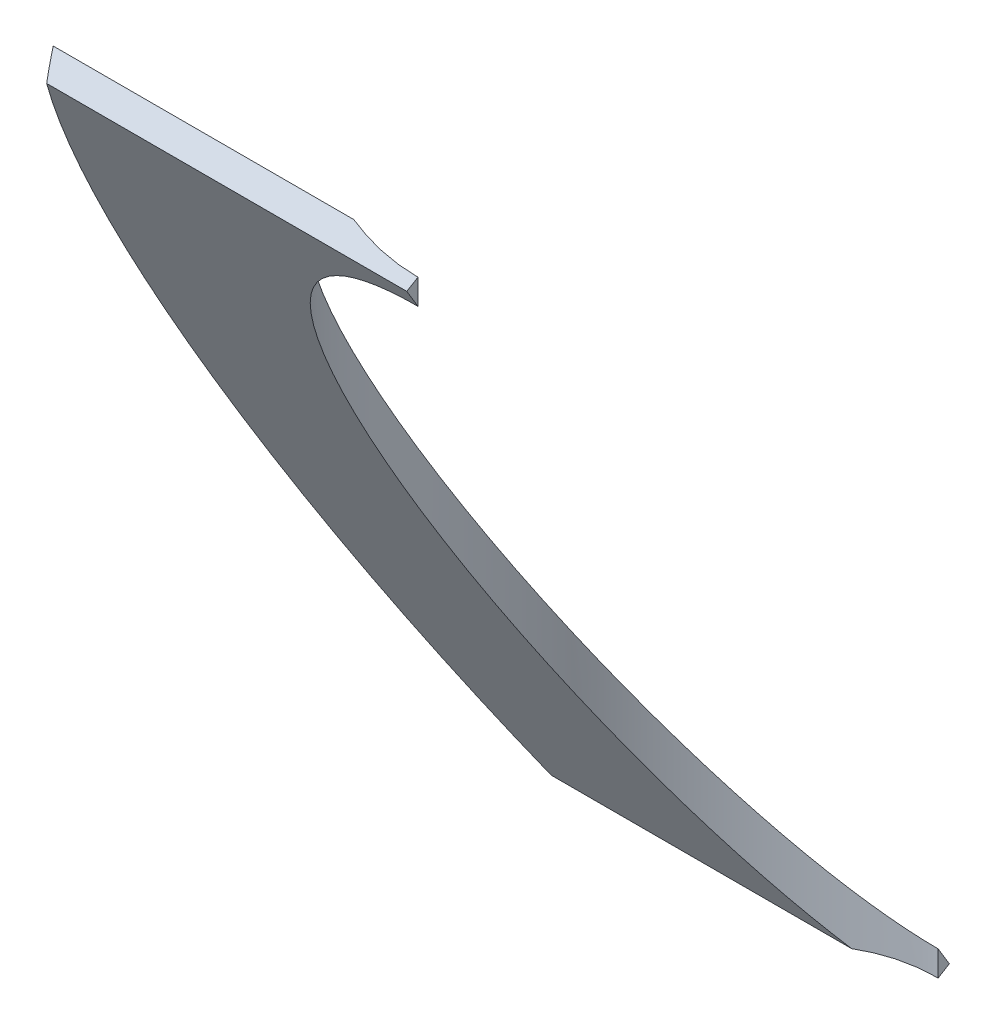
ISO-10303-21;
HEADER;
FILE_DESCRIPTION(('STEP AP214'),'2;1');
FILE_NAME('part.step','',(''),(''),'','','');
FILE_SCHEMA(('AUTOMOTIVE_DESIGN { 1 0 10303 214 1 1 1 1 }'));
ENDSEC;
DATA;
#1=APPLICATION_CONTEXT('core data for automotive mechanical design processes');
#2=APPLICATION_PROTOCOL_DEFINITION('international standard','automotive_design',2000,#1);
#3=PRODUCT_CONTEXT('',#1,'mechanical');
#4=PRODUCT('Part','Part','',(#3));
#5=PRODUCT_RELATED_PRODUCT_CATEGORY('part','',(#4));
#6=PRODUCT_DEFINITION_FORMATION('','',#4);
#7=PRODUCT_DEFINITION_CONTEXT('part definition',#1,'design');
#8=PRODUCT_DEFINITION('design','',#6,#7);
#9=PRODUCT_DEFINITION_SHAPE('','',#8);
#10=(LENGTH_UNIT() NAMED_UNIT(*) SI_UNIT(.MILLI.,.METRE.));
#11=(NAMED_UNIT(*) PLANE_ANGLE_UNIT() SI_UNIT($,.RADIAN.));
#12=(NAMED_UNIT(*) SI_UNIT($,.STERADIAN.) SOLID_ANGLE_UNIT());
#13=UNCERTAINTY_MEASURE_WITH_UNIT(LENGTH_MEASURE(1.E-05),#10,'distance_accuracy_value','');
#14=(GEOMETRIC_REPRESENTATION_CONTEXT(3) GLOBAL_UNCERTAINTY_ASSIGNED_CONTEXT((#13)) GLOBAL_UNIT_ASSIGNED_CONTEXT((#10,
#11,#12)) REPRESENTATION_CONTEXT('',''));
#15=CARTESIAN_POINT('',(0.,0.,0.));
#16=DIRECTION('',(0.,0.,1.));
#17=DIRECTION('',(1.,0.,0.));
#18=AXIS2_PLACEMENT_3D('',#15,#16,#17);
#19=CARTESIAN_POINT('',(0.,-0.0100000000000347,0.));
#20=DIRECTION('',(0.,1.,0.));
#21=DIRECTION('',(0.,0.,1.));
#22=AXIS2_PLACEMENT_3D('',#19,#20,#21);
#23=CYLINDRICAL_SURFACE('',#22,30.);
#24=CARTESIAN_POINT('',(0.,122.915475947423,0.));
#25=DIRECTION('',(0.,0.514495755427527,-0.857492925712544));
#26=DIRECTION('',(0.,-0.857492925712544,-0.514495755427526));
#27=AXIS2_PLACEMENT_3D('',#24,#25,#26);
#28=ELLIPSE('',#27,58.309518948453,30.);
#29=CARTESIAN_POINT('',(0.,72.9154759474226,-30.));
#30=VERTEX_POINT('',#29);
#31=CARTESIAN_POINT('',(-8.69022160531155,170.771743633141,28.7137606114312));
#32=VERTEX_POINT('',#31);
#33=EDGE_CURVE('E11',#30,#32,#28,.T.);
#34=ORIENTED_EDGE('',*,*,#33,.T.);
#35=CARTESIAN_POINT('',(0.,188.,0.));
#36=DIRECTION('',(0.,-0.857492925712544,-0.514495755427527));
#37=DIRECTION('',(0.,-0.514495755427527,0.857492925712544));
#38=AXIS2_PLACEMENT_3D('',#35,#36,#37);
#39=ELLIPSE('',#38,34.9857113690718,30.);
#40=CARTESIAN_POINT('',(0.,170.,30.));
#41=VERTEX_POINT('',#40);
#42=EDGE_CURVE('E57',#41,#32,#39,.T.);
#43=ORIENTED_EDGE('',*,*,#42,.F.);
#44=DIRECTION('',(0.,-1.,0.));
#45=VECTOR('',#44,1.);
#46=CARTESIAN_POINT('',(0.,190.,30.));
#47=LINE('',#46,#45);
#48=CARTESIAN_POINT('',(0.,167.084524052577,30.));
#49=VERTEX_POINT('',#48);
#50=EDGE_CURVE('E123',#49,#41,#47,.F.);
#51=ORIENTED_EDGE('',*,*,#50,.F.);
#52=CARTESIAN_POINT('',(0.,117.084524052577,0.));
#53=DIRECTION('',(0.,0.514495755427527,-0.857492925712544));
#54=DIRECTION('',(0.,-0.857492925712544,-0.514495755427526));
#55=AXIS2_PLACEMENT_3D('',#52,#53,#54);
#56=ELLIPSE('',#55,58.309518948453,30.);
#57=CARTESIAN_POINT('',(-8.69022160531146,69.2282563668587,-28.7137606114312));
#58=VERTEX_POINT('',#57);
#59=EDGE_CURVE('E125',#58,#49,#56,.T.);
#60=ORIENTED_EDGE('',*,*,#59,.F.);
#61=CARTESIAN_POINT('',(0.,52.,0.));
#62=DIRECTION('',(0.,0.857492925712544,0.514495755427527));
#63=DIRECTION('',(0.,-0.514495755427527,0.857492925712544));
#64=AXIS2_PLACEMENT_3D('',#61,#62,#63);
#65=ELLIPSE('',#64,34.9857113690718,30.);
#66=CARTESIAN_POINT('',(0.,70.,-30.));
#67=VERTEX_POINT('',#66);
#68=EDGE_CURVE('E42',#67,#58,#65,.T.);
#69=ORIENTED_EDGE('',*,*,#68,.F.);
#70=DIRECTION('',(0.,-1.,0.));
#71=VECTOR('',#70,1.);
#72=CARTESIAN_POINT('',(0.,190.,-30.));
#73=LINE('',#72,#71);
#74=EDGE_CURVE('E49',#30,#67,#73,.T.);
#75=ORIENTED_EDGE('',*,*,#74,.F.);
#76=EDGE_LOOP('',(#34,#43,#51,#60,#69,#75));
#77=FACE_BOUND('',#76,.T.);
#78=ADVANCED_FACE('F34',(#77),#23,.F.);
#79=CARTESIAN_POINT('',(0.,69.2282563668587,-28.7137606114312));
#80=DIRECTION('',(-1.,0.,0.));
#81=DIRECTION('',(0.,0.,1.));
#82=AXIS2_PLACEMENT_3D('',#79,#80,#81);
#83=PLANE('',#82);
#84=DIRECTION('',(0.,0.857492925712544,0.514495755427526));
#85=VECTOR('',#84,1.);
#86=CARTESIAN_POINT('',(0.,70.7717436331413,-31.2862393885688));
#87=LINE('',#86,#85);
#88=CARTESIAN_POINT('',(0.,70.7717436331413,-31.2862393885688));
#89=VERTEX_POINT('',#88);
#90=EDGE_CURVE('E115',#89,#30,#87,.T.);
#91=ORIENTED_EDGE('',*,*,#90,.T.);
#92=ORIENTED_EDGE('',*,*,#74,.T.);
#93=DIRECTION('',(0.,0.514495755427527,-0.857492925712544));
#94=VECTOR('',#93,1.);
#95=CARTESIAN_POINT('',(0.,69.2282563668587,-28.7137606114312));
#96=LINE('',#95,#94);
#97=EDGE_CURVE('E126',#67,#89,#96,.T.);
#98=ORIENTED_EDGE('',*,*,#97,.T.);
#99=EDGE_LOOP('',(#91,#92,#98));
#100=FACE_BOUND('',#99,.T.);
#101=ADVANCED_FACE('F144',(#100),#83,.F.);
#102=CARTESIAN_POINT('',(0.,169.228256366859,31.2862393885688));
#103=DIRECTION('',(0.,-0.857492925712544,-0.514495755427527));
#104=DIRECTION('',(0.,0.514495755427527,-0.857492925712544));
#105=AXIS2_PLACEMENT_3D('',#102,#103,#104);
#106=PLANE('',#105);
#107=CARTESIAN_POINT('',(0.,188.,0.));
#108=DIRECTION('',(0.,-0.857492925712544,-0.514495755427527));
#109=DIRECTION('',(0.,0.514495755427527,-0.857492925712544));
#110=AXIS2_PLACEMENT_3D('',#107,#108,#109);
#111=ELLIPSE('',#110,60.6418997063911,52.);
#112=CARTESIAN_POINT('',(-41.5351805692616,169.228256366859,31.2862393885688));
#113=VERTEX_POINT('',#112);
#114=CARTESIAN_POINT('',(-43.3534306779685,170.771743633141,28.7137606114312));
#115=VERTEX_POINT('',#114);
#116=EDGE_CURVE('E106',#113,#115,#111,.T.);
#117=ORIENTED_EDGE('',*,*,#116,.F.);
#118=DIRECTION('',(-1.,0.,0.));
#119=VECTOR('',#118,1.);
#120=CARTESIAN_POINT('',(0.,169.228256366859,31.2862393885688));
#121=LINE('',#120,#119);
#122=CARTESIAN_POINT('',(0.,169.228256366859,31.2862393885688));
#123=VERTEX_POINT('',#122);
#124=EDGE_CURVE('E109',#123,#113,#121,.T.);
#125=ORIENTED_EDGE('',*,*,#124,.F.);
#126=DIRECTION('',(0.,0.514495755427527,-0.857492925712544));
#127=VECTOR('',#126,1.);
#128=CARTESIAN_POINT('',(0.,169.228256366859,31.2862393885688));
#129=LINE('',#128,#127);
#130=EDGE_CURVE('E119',#123,#41,#129,.T.);
#131=ORIENTED_EDGE('',*,*,#130,.T.);
#132=ORIENTED_EDGE('',*,*,#42,.T.);
#133=DIRECTION('',(-1.,0.,0.));
#134=VECTOR('',#133,1.);
#135=CARTESIAN_POINT('',(0.,170.771743633141,28.7137606114312));
#136=LINE('',#135,#134);
#137=EDGE_CURVE('E99',#32,#115,#136,.T.);
#138=ORIENTED_EDGE('',*,*,#137,.T.);
#139=EDGE_LOOP('',(#117,#125,#131,#132,#138));
#140=FACE_BOUND('',#139,.T.);
#141=ADVANCED_FACE('F138',(#140),#106,.F.);
#142=DIRECTION('',(0.,0.857492925712544,0.514495755427526));
#143=VECTOR('',#142,1.);
#144=CARTESIAN_POINT('',(0.,69.2282563668587,-28.7137606114312));
#145=LINE('',#144,#143);
#146=EDGE_CURVE('E98',#49,#123,#145,.T.);
#147=ORIENTED_EDGE('',*,*,#146,.F.);
#148=ORIENTED_EDGE('',*,*,#50,.T.);
#149=ORIENTED_EDGE('',*,*,#130,.F.);
#150=EDGE_LOOP('',(#147,#148,#149));
#151=FACE_BOUND('',#150,.T.);
#152=ADVANCED_FACE('F137',(#151),#83,.F.);
#153=CARTESIAN_POINT('',(0.,69.2282563668587,-28.7137606114312));
#154=DIRECTION('',(0.,0.857492925712544,0.514495755427527));
#155=DIRECTION('',(0.,-0.514495755427527,0.857492925712544));
#156=AXIS2_PLACEMENT_3D('',#153,#154,#155);
#157=PLANE('',#156);
#158=CARTESIAN_POINT('',(0.,52.,0.));
#159=DIRECTION('',(0.,0.857492925712544,0.514495755427527));
#160=DIRECTION('',(0.,0.514495755427527,-0.857492925712544));
#161=AXIS2_PLACEMENT_3D('',#158,#159,#160);
#162=ELLIPSE('',#161,60.6418997063911,52.);
#163=CARTESIAN_POINT('',(-41.5351805692616,70.7717436331413,-31.2862393885688));
#164=VERTEX_POINT('',#163);
#165=CARTESIAN_POINT('',(-43.3534306779685,69.2282563668587,-28.7137606114312));
#166=VERTEX_POINT('',#165);
#167=EDGE_CURVE('E92',#164,#166,#162,.T.);
#168=ORIENTED_EDGE('',*,*,#167,.F.);
#169=DIRECTION('',(1.,0.,0.));
#170=VECTOR('',#169,1.);
#171=CARTESIAN_POINT('',(0.,70.7717436331413,-31.2862393885688));
#172=LINE('',#171,#170);
#173=EDGE_CURVE('E114',#164,#89,#172,.T.);
#174=ORIENTED_EDGE('',*,*,#173,.T.);
#175=ORIENTED_EDGE('',*,*,#97,.F.);
#176=ORIENTED_EDGE('',*,*,#68,.T.);
#177=DIRECTION('',(1.,0.,0.));
#178=VECTOR('',#177,1.);
#179=CARTESIAN_POINT('',(0.,69.2282563668587,-28.7137606114312));
#180=LINE('',#179,#178);
#181=EDGE_CURVE('E89',#166,#58,#180,.T.);
#182=ORIENTED_EDGE('',*,*,#181,.F.);
#183=EDGE_LOOP('',(#168,#174,#175,#176,#182));
#184=FACE_BOUND('',#183,.T.);
#185=ADVANCED_FACE('F91',(#184),#157,.F.);
#186=CARTESIAN_POINT('',(0.,-0.01,0.));
#187=DIRECTION('',(0.,1.,0.));
#188=DIRECTION('',(0.,0.,1.));
#189=AXIS2_PLACEMENT_3D('',#186,#187,#188);
#190=CYLINDRICAL_SURFACE('',#189,52.);
#191=CARTESIAN_POINT('',(0.,117.084524052577,0.));
#192=DIRECTION('',(0.,0.514495755427527,-0.857492925712544));
#193=DIRECTION('',(0.,0.857492925712544,0.514495755427526));
#194=AXIS2_PLACEMENT_3D('',#191,#192,#193);
#195=ELLIPSE('',#194,101.069832843985,52.);
#196=EDGE_CURVE('E104',#166,#113,#195,.T.);
#197=ORIENTED_EDGE('',*,*,#196,.T.);
#198=ORIENTED_EDGE('',*,*,#116,.T.);
#199=CARTESIAN_POINT('',(0.,122.915475947423,0.));
#200=DIRECTION('',(0.,0.514495755427527,-0.857492925712544));
#201=DIRECTION('',(0.,0.857492925712544,0.514495755427526));
#202=AXIS2_PLACEMENT_3D('',#199,#200,#201);
#203=ELLIPSE('',#202,101.069832843985,52.);
#204=EDGE_CURVE('E37',#164,#115,#203,.T.);
#205=ORIENTED_EDGE('',*,*,#204,.F.);
#206=ORIENTED_EDGE('',*,*,#167,.T.);
#207=EDGE_LOOP('',(#197,#198,#205,#206));
#208=FACE_BOUND('',#207,.T.);
#209=ADVANCED_FACE('F102',(#208),#190,.T.);
#210=CARTESIAN_POINT('',(0.,30.9929622492117,-51.6549370820194));
#211=DIRECTION('',(0.,0.514495755427527,-0.857492925712544));
#212=DIRECTION('',(0.,0.857492925712544,0.514495755427526));
#213=AXIS2_PLACEMENT_3D('',#210,#211,#212);
#214=PLANE('',#213);
#215=ORIENTED_EDGE('',*,*,#196,.F.);
#216=ORIENTED_EDGE('',*,*,#181,.T.);
#217=ORIENTED_EDGE('',*,*,#59,.T.);
#218=ORIENTED_EDGE('',*,*,#146,.T.);
#219=ORIENTED_EDGE('',*,*,#124,.T.);
#220=EDGE_LOOP('',(#215,#216,#217,#218,#219));
#221=FACE_BOUND('',#220,.T.);
#222=ADVANCED_FACE('F107',(#221),#214,.F.);
#223=CARTESIAN_POINT('',(0.,32.5364495154942,-54.2274158591571));
#224=DIRECTION('',(0.,0.514495755427527,-0.857492925712544));
#225=DIRECTION('',(0.,0.857492925712544,0.514495755427526));
#226=AXIS2_PLACEMENT_3D('',#223,#224,#225);
#227=PLANE('',#226);
#228=ORIENTED_EDGE('',*,*,#173,.F.);
#229=ORIENTED_EDGE('',*,*,#204,.T.);
#230=ORIENTED_EDGE('',*,*,#137,.F.);
#231=ORIENTED_EDGE('',*,*,#33,.F.);
#232=ORIENTED_EDGE('',*,*,#90,.F.);
#233=EDGE_LOOP('',(#228,#229,#230,#231,#232));
#234=FACE_BOUND('',#233,.T.);
#235=ADVANCED_FACE('F141',(#234),#227,.T.);
#236=CLOSED_SHELL('',(#78,#101,#141,#152,#185,#209,#222,#235));
#237=MANIFOLD_SOLID_BREP('B2',#236);
#238=ADVANCED_BREP_SHAPE_REPRESENTATION('',(#18,#237),#14);
#239=SHAPE_DEFINITION_REPRESENTATION(#9,#238);
ENDSEC;
END-ISO-10303-21;
